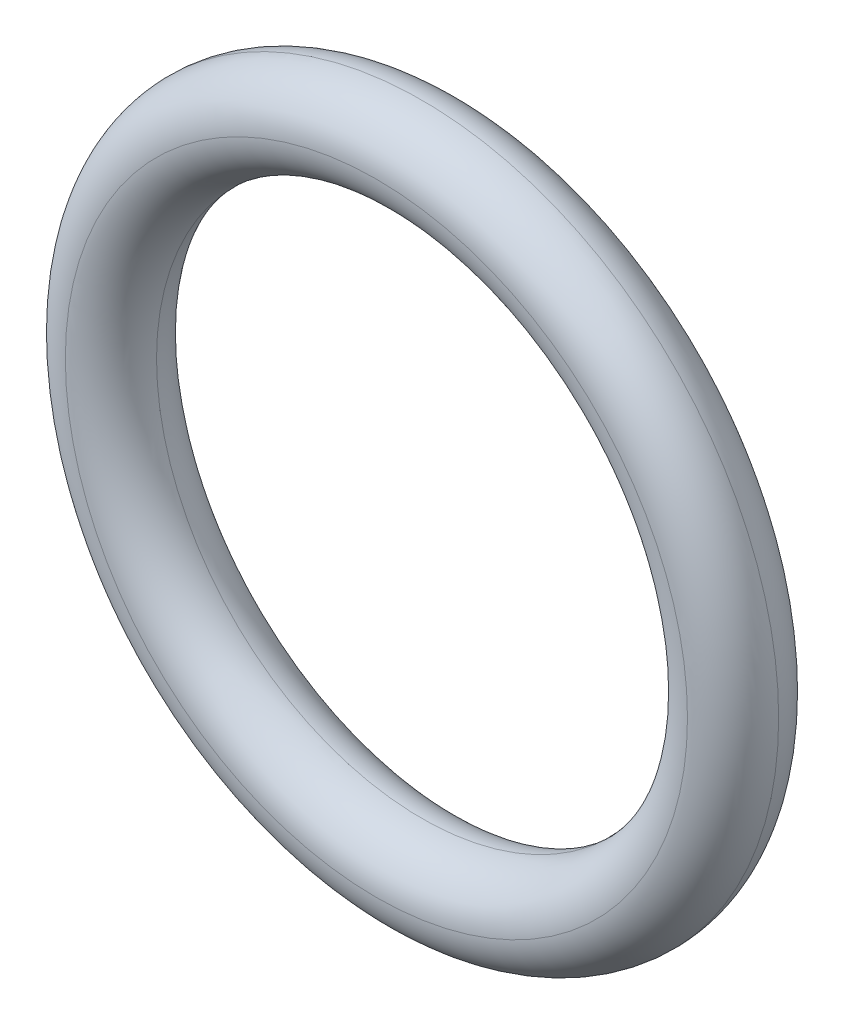
ISO-10303-21;
HEADER;
FILE_DESCRIPTION(('STEP AP214'),'2;1');
FILE_NAME('part.step','',(''),(''),'','','');
FILE_SCHEMA(('AUTOMOTIVE_DESIGN { 1 0 10303 214 1 1 1 1 }'));
ENDSEC;
DATA;
#1=APPLICATION_CONTEXT('core data for automotive mechanical design processes');
#2=APPLICATION_PROTOCOL_DEFINITION('international standard','automotive_design',2000,#1);
#3=PRODUCT_CONTEXT('',#1,'mechanical');
#4=PRODUCT('Part','Part','',(#3));
#5=PRODUCT_RELATED_PRODUCT_CATEGORY('part','',(#4));
#6=PRODUCT_DEFINITION_FORMATION('','',#4);
#7=PRODUCT_DEFINITION_CONTEXT('part definition',#1,'design');
#8=PRODUCT_DEFINITION('design','',#6,#7);
#9=PRODUCT_DEFINITION_SHAPE('','',#8);
#10=(LENGTH_UNIT() NAMED_UNIT(*) SI_UNIT(.MILLI.,.METRE.));
#11=(NAMED_UNIT(*) PLANE_ANGLE_UNIT() SI_UNIT($,.RADIAN.));
#12=(NAMED_UNIT(*) SI_UNIT($,.STERADIAN.) SOLID_ANGLE_UNIT());
#13=UNCERTAINTY_MEASURE_WITH_UNIT(LENGTH_MEASURE(1.E-05),#10,'distance_accuracy_value','');
#14=(GEOMETRIC_REPRESENTATION_CONTEXT(3) GLOBAL_UNCERTAINTY_ASSIGNED_CONTEXT((#13)) GLOBAL_UNIT_ASSIGNED_CONTEXT((#10,
#11,#12)) REPRESENTATION_CONTEXT('',''));
#15=CARTESIAN_POINT('',(0.,0.,0.));
#16=DIRECTION('',(0.,0.,1.));
#17=DIRECTION('',(1.,0.,0.));
#18=AXIS2_PLACEMENT_3D('',#15,#16,#17);
#19=CARTESIAN_POINT('',(0.,0.,-1.2192));
#20=DIRECTION('',(0.,0.,1.));
#21=DIRECTION('',(1.,0.,0.));
#22=AXIS2_PLACEMENT_3D('',#19,#20,#21);
#23=TOROIDAL_SURFACE('',#22,8.3185,1.2192);
#24=CARTESIAN_POINT('',(0.,0.,-1.2192));
#25=DIRECTION('',(0.,0.,1.));
#26=DIRECTION('',(1.,0.,0.));
#27=AXIS2_PLACEMENT_3D('',#24,#25,#26);
#28=CIRCLE('',#27,9.5377);
#29=CARTESIAN_POINT('',(9.5377,0.,-1.2192));
#30=VERTEX_POINT('',#29);
#31=EDGE_CURVE('E39',#30,#30,#28,.F.);
#32=ORIENTED_EDGE('',*,*,#31,.F.);
#33=EDGE_LOOP('',(#32));
#34=FACE_BOUND('',#33,.T.);
#35=CARTESIAN_POINT('',(0.,0.,0.));
#36=DIRECTION('',(0.,0.,1.));
#37=DIRECTION('',(1.,0.,0.));
#38=AXIS2_PLACEMENT_3D('',#35,#36,#37);
#39=CIRCLE('',#38,8.3185);
#40=CARTESIAN_POINT('',(8.3185,0.,0.));
#41=VERTEX_POINT('',#40);
#42=EDGE_CURVE('E10',#41,#41,#39,.T.);
#43=ORIENTED_EDGE('',*,*,#42,.F.);
#44=EDGE_LOOP('',(#43));
#45=FACE_BOUND('',#44,.T.);
#46=ADVANCED_FACE('F33',(#34,#45),#23,.T.);
#47=CARTESIAN_POINT('',(0.,0.,-1.2192));
#48=DIRECTION('',(0.,0.,1.));
#49=DIRECTION('',(1.,0.,0.));
#50=AXIS2_PLACEMENT_3D('',#47,#48,#49);
#51=TOROIDAL_SURFACE('',#50,8.3185,1.2192);
#52=ORIENTED_EDGE('',*,*,#42,.T.);
#53=EDGE_LOOP('',(#52));
#54=FACE_BOUND('',#53,.T.);
#55=CARTESIAN_POINT('',(0.,0.,-1.2192));
#56=DIRECTION('',(0.,0.,1.));
#57=DIRECTION('',(1.,0.,0.));
#58=AXIS2_PLACEMENT_3D('',#55,#56,#57);
#59=CIRCLE('',#58,7.0993);
#60=CARTESIAN_POINT('',(7.0993,0.,-1.2192));
#61=VERTEX_POINT('',#60);
#62=EDGE_CURVE('E43',#61,#61,#59,.T.);
#63=ORIENTED_EDGE('',*,*,#62,.F.);
#64=EDGE_LOOP('',(#63));
#65=FACE_BOUND('',#64,.T.);
#66=ADVANCED_FACE('F57',(#54,#65),#51,.T.);
#67=CARTESIAN_POINT('',(0.,0.,-1.2192));
#68=DIRECTION('',(0.,0.,1.));
#69=DIRECTION('',(1.,0.,0.));
#70=AXIS2_PLACEMENT_3D('',#67,#68,#69);
#71=TOROIDAL_SURFACE('',#70,8.3185,1.2192);
#72=ORIENTED_EDGE('',*,*,#31,.T.);
#73=EDGE_LOOP('',(#72));
#74=FACE_BOUND('',#73,.T.);
#75=CARTESIAN_POINT('',(0.,0.,-2.4384));
#76=DIRECTION('',(0.,0.,1.));
#77=DIRECTION('',(1.,0.,0.));
#78=AXIS2_PLACEMENT_3D('',#75,#76,#77);
#79=CIRCLE('',#78,8.3185);
#80=CARTESIAN_POINT('',(8.3185,0.,-2.4384));
#81=VERTEX_POINT('',#80);
#82=EDGE_CURVE('E47',#81,#81,#79,.F.);
#83=ORIENTED_EDGE('',*,*,#82,.F.);
#84=EDGE_LOOP('',(#83));
#85=FACE_BOUND('',#84,.T.);
#86=ADVANCED_FACE('F55',(#74,#85),#71,.T.);
#87=CARTESIAN_POINT('',(0.,0.,-1.2192));
#88=DIRECTION('',(0.,0.,1.));
#89=DIRECTION('',(1.,0.,0.));
#90=AXIS2_PLACEMENT_3D('',#87,#88,#89);
#91=TOROIDAL_SURFACE('',#90,8.3185,1.2192);
#92=ORIENTED_EDGE('',*,*,#62,.T.);
#93=EDGE_LOOP('',(#92));
#94=FACE_BOUND('',#93,.T.);
#95=ORIENTED_EDGE('',*,*,#82,.T.);
#96=EDGE_LOOP('',(#95));
#97=FACE_BOUND('',#96,.T.);
#98=ADVANCED_FACE('F53',(#94,#97),#91,.T.);
#99=CLOSED_SHELL('',(#46,#66,#86,#98));
#100=MANIFOLD_SOLID_BREP('B2',#99);
#101=ADVANCED_BREP_SHAPE_REPRESENTATION('',(#18,#100),#14);
#102=SHAPE_DEFINITION_REPRESENTATION(#9,#101);
ENDSEC;
END-ISO-10303-21;
